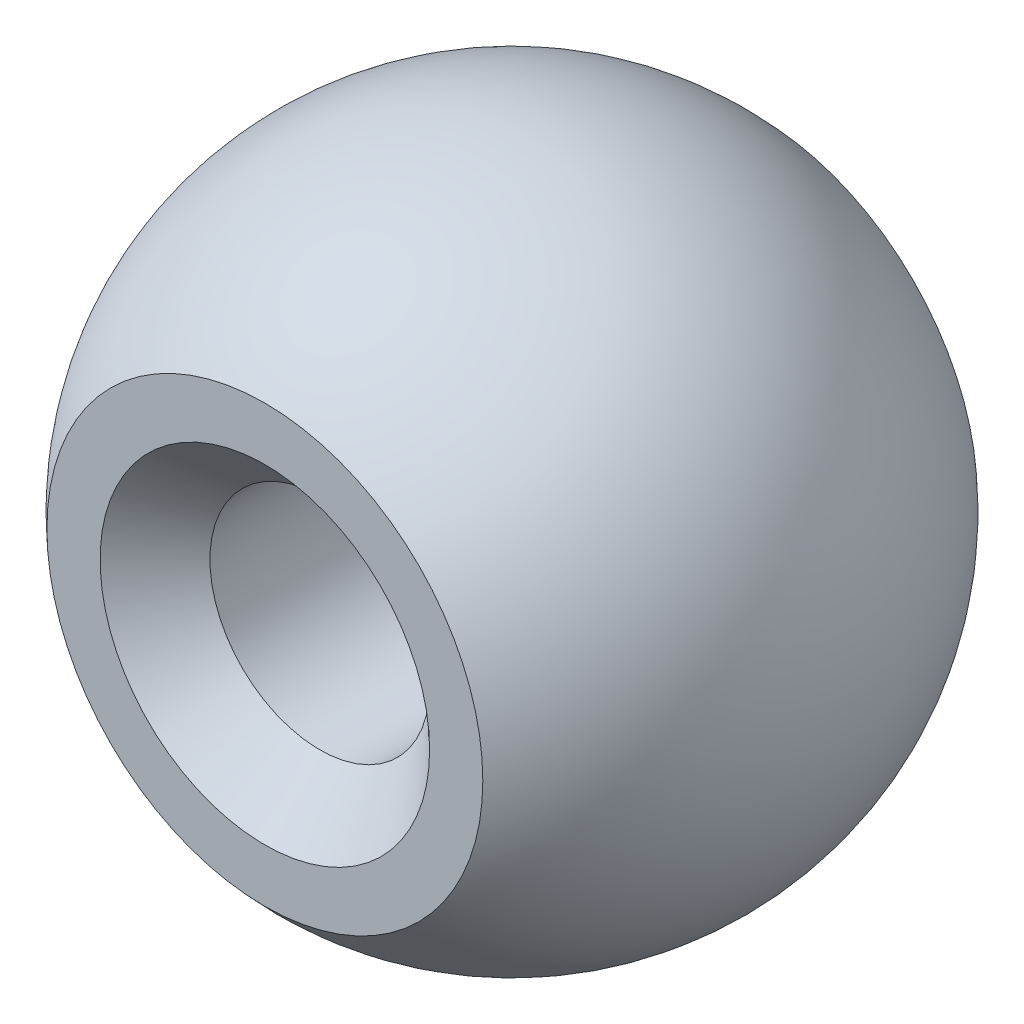
ISO-10303-21;
HEADER;
FILE_DESCRIPTION(('STEP AP214'),'2;1');
FILE_NAME('part.step','',(''),(''),'','','');
FILE_SCHEMA(('AUTOMOTIVE_DESIGN { 1 0 10303 214 1 1 1 1 }'));
ENDSEC;
DATA;
#1=APPLICATION_CONTEXT('core data for automotive mechanical design processes');
#2=APPLICATION_PROTOCOL_DEFINITION('international standard','automotive_design',2000,#1);
#3=PRODUCT_CONTEXT('',#1,'mechanical');
#4=PRODUCT('Part','Part','',(#3));
#5=PRODUCT_RELATED_PRODUCT_CATEGORY('part','',(#4));
#6=PRODUCT_DEFINITION_FORMATION('','',#4);
#7=PRODUCT_DEFINITION_CONTEXT('part definition',#1,'design');
#8=PRODUCT_DEFINITION('design','',#6,#7);
#9=PRODUCT_DEFINITION_SHAPE('','',#8);
#10=(LENGTH_UNIT() NAMED_UNIT(*) SI_UNIT(.MILLI.,.METRE.));
#11=(NAMED_UNIT(*) PLANE_ANGLE_UNIT() SI_UNIT($,.RADIAN.));
#12=(NAMED_UNIT(*) SI_UNIT($,.STERADIAN.) SOLID_ANGLE_UNIT());
#13=UNCERTAINTY_MEASURE_WITH_UNIT(LENGTH_MEASURE(1.E-05),#10,'distance_accuracy_value','');
#14=(GEOMETRIC_REPRESENTATION_CONTEXT(3) GLOBAL_UNCERTAINTY_ASSIGNED_CONTEXT((#13)) GLOBAL_UNIT_ASSIGNED_CONTEXT((#10,
#11,#12)) REPRESENTATION_CONTEXT('',''));
#15=CARTESIAN_POINT('',(0.,0.,0.));
#16=DIRECTION('',(0.,0.,1.));
#17=DIRECTION('',(1.,0.,0.));
#18=AXIS2_PLACEMENT_3D('',#15,#16,#17);
#19=CARTESIAN_POINT('',(0.,0.,0.));
#20=DIRECTION('',(0.,0.,1.));
#21=DIRECTION('',(1.,0.,0.));
#22=AXIS2_PLACEMENT_3D('',#19,#20,#21);
#23=SPHERICAL_SURFACE('',#22,6.);
#24=CARTESIAN_POINT('',(0.,0.,-4.5));
#25=DIRECTION('',(0.,0.,1.));
#26=DIRECTION('',(1.,0.,0.));
#27=AXIS2_PLACEMENT_3D('',#24,#25,#26);
#28=CIRCLE('',#27,3.96862696659689);
#29=CARTESIAN_POINT('',(3.96862696659689,0.,-4.5));
#30=VERTEX_POINT('',#29);
#31=EDGE_CURVE('E10',#30,#30,#28,.T.);
#32=CARTESIAN_POINT('',(0.,0.,4.5));
#33=DIRECTION('',(0.,0.,1.));
#34=DIRECTION('',(1.,0.,0.));
#35=AXIS2_PLACEMENT_3D('',#32,#33,#34);
#36=CIRCLE('',#35,3.96862696659689);
#37=CARTESIAN_POINT('',(3.96862696659689,0.,4.5));
#38=VERTEX_POINT('',#37);
#39=EDGE_CURVE('E46',#38,#38,#36,.T.);
#40=CARTESIAN_POINT('',(3.96862696659689,0.,-4.5));
#41=CARTESIAN_POINT('',(4.04813476780701,0.,-4.42988448417367));
#42=CARTESIAN_POINT('',(4.12578044526497,0.,-4.35765791170532));
#43=CARTESIAN_POINT('',(4.27713817883407,0.,-4.20919440386366));
#44=CARTESIAN_POINT('',(4.35085023494521,0.,-4.13295746849034));
#45=CARTESIAN_POINT('',(4.4941313519782,0.,-3.97668498521782));
#46=CARTESIAN_POINT('',(4.56370041290005,0.,-3.89664943731862));
#47=CARTESIAN_POINT('',(4.69850076282097,0.,-3.73300516695229));
#48=CARTESIAN_POINT('',(4.76373205182003,0.,-3.64939644448515));
#49=CARTESIAN_POINT('',(4.8896734716426,0.,-3.47884049038039));
#50=CARTESIAN_POINT('',(4.9503836024661,0.,-3.39189325874275));
#51=CARTESIAN_POINT('',(5.06711223105534,0.,-3.21490454544201));
#52=CARTESIAN_POINT('',(5.12313072882108,0.,-3.1248630637789));
#53=CARTESIAN_POINT('',(5.23031873710099,0.,-2.94193874249415));
#54=CARTESIAN_POINT('',(5.28148824761517,0.,-2.84905590287252));
#55=CARTESIAN_POINT('',(5.37883456206913,0.,-2.66070975397032));
#56=CARTESIAN_POINT('',(5.42501136600891,0.,-2.56524644468976));
#57=CARTESIAN_POINT('',(5.51224256718487,0.,-2.37200748850401));
#58=CARTESIAN_POINT('',(5.55329696442104,0.,-2.27423184159881));
#59=CARTESIAN_POINT('',(5.63016804073458,0.,-2.07664283810176));
#60=CARTESIAN_POINT('',(5.66598471981195,0.,-1.9768294815099));
#61=CARTESIAN_POINT('',(5.73227975951892,0.,-1.77544540970266));
#62=CARTESIAN_POINT('',(5.76275812014852,0.,-1.67387469448727));
#63=CARTESIAN_POINT('',(5.81829091677091,0.,-1.46926119256368));
#64=CARTESIAN_POINT('',(5.84334535276371,0.,-1.36621840585547));
#65=CARTESIAN_POINT('',(5.8879599283703,0.,-1.1589501827416));
#66=CARTESIAN_POINT('',(5.90752006798411,0.,-1.05472474633594));
#67=CARTESIAN_POINT('',(5.94109111122104,0.,-0.845383967399882));
#68=CARTESIAN_POINT('',(5.95510201484416,0.,-0.740268624869488));
#69=CARTESIAN_POINT('',(5.97753523292316,0.,-0.529443276782206));
#70=CARTESIAN_POINT('',(5.98595754737904,0.,-0.423733271225317));
#71=CARTESIAN_POINT('',(5.99718993091746,0.,-0.212015510445619));
#72=CARTESIAN_POINT('',(6.,0.,-0.10600775522281));
#73=CARTESIAN_POINT('',(6.,0.,0.10600775522281));
#74=CARTESIAN_POINT('',(5.99718993091746,0.,0.212015510445619));
#75=CARTESIAN_POINT('',(5.98595754737904,0.,0.423733271225317));
#76=CARTESIAN_POINT('',(5.97753523292316,0.,0.529443276782206));
#77=CARTESIAN_POINT('',(5.95510201484416,0.,0.740268624869488));
#78=CARTESIAN_POINT('',(5.94109111122104,0.,0.845383967399882));
#79=CARTESIAN_POINT('',(5.90752006798411,0.,1.05472474633594));
#80=CARTESIAN_POINT('',(5.8879599283703,0.,1.1589501827416));
#81=CARTESIAN_POINT('',(5.84334535276371,0.,1.36621840585547));
#82=CARTESIAN_POINT('',(5.81829091677091,0.,1.46926119256368));
#83=CARTESIAN_POINT('',(5.76275812014852,0.,1.67387469448727));
#84=CARTESIAN_POINT('',(5.73227975951892,0.,1.77544540970266));
#85=CARTESIAN_POINT('',(5.66598471981195,0.,1.9768294815099));
#86=CARTESIAN_POINT('',(5.63016804073458,0.,2.07664283810176));
#87=CARTESIAN_POINT('',(5.55329696442104,0.,2.27423184159881));
#88=CARTESIAN_POINT('',(5.51224256718487,0.,2.37200748850401));
#89=CARTESIAN_POINT('',(5.42501136600891,0.,2.56524644468976));
#90=CARTESIAN_POINT('',(5.37883456206913,0.,2.66070975397032));
#91=CARTESIAN_POINT('',(5.28148824761517,0.,2.84905590287252));
#92=CARTESIAN_POINT('',(5.23031873710099,0.,2.94193874249415));
#93=CARTESIAN_POINT('',(5.12313072882108,0.,3.1248630637789));
#94=CARTESIAN_POINT('',(5.06711223105534,0.,3.21490454544201));
#95=CARTESIAN_POINT('',(4.9503836024661,0.,3.39189325874275));
#96=CARTESIAN_POINT('',(4.8896734716426,0.,3.47884049038039));
#97=CARTESIAN_POINT('',(4.76373205182003,0.,3.64939644448515));
#98=CARTESIAN_POINT('',(4.69850076282097,0.,3.73300516695229));
#99=CARTESIAN_POINT('',(4.56370041290005,0.,3.89664943731862));
#100=CARTESIAN_POINT('',(4.4941313519782,0.,3.97668498521782));
#101=CARTESIAN_POINT('',(4.35085023494521,0.,4.13295746849034));
#102=CARTESIAN_POINT('',(4.27713817883407,0.,4.20919440386366));
#103=CARTESIAN_POINT('',(4.12578044526497,0.,4.35765791170532));
#104=CARTESIAN_POINT('',(4.04813476780702,0.,4.42988448417367));
#105=CARTESIAN_POINT('',(3.96862696659689,0.,4.5));
#106=B_SPLINE_CURVE_WITH_KNOTS('',3,(#40,#41,#42,#43,#44,#45,#46,#47,#48,#49,#50,#51,#52,#53,
#54,#55,#56,#57,#58,#59,#60,#61,#62,#63,#64,#65,#66,#67,#68,#69,#70,#71,#72,#73,#74,#75,#76,#77,
#78,#79,#80,#81,#82,#83,#84,#85,#86,#87,#88,#89,#90,#91,#92,#93,#94,#95,#96,#97,#98,#99,#100,
#101,#102,#103,#104,#105),.UNSPECIFIED.,.F.,.F.,(4,2,2,2,2,2,2,2,2,2,2,2,2,2,2,2,2,2,2,2,2,2,2,
2,2,2,2,2,2,2,2,2,4),(0.,0.317986053500718,0.635972107001436,0.953958160502155,1.27194421400287,
1.58993026750359,1.90791632100431,2.22590237450503,2.54388842800575,2.86187448150647,
3.17986053500718,3.4978465885079,3.81583264200862,4.13381869550934,4.45180474901006,
4.76979080251078,5.08777685601149,5.40576290951221,5.72374896301293,6.04173501651365,
6.35972107001437,6.67770712351508,6.9956931770158,7.31367923051652,7.63166528401724,
7.94965133751796,8.26763739101868,8.5856234445194,8.90360949802011,9.22159555152083,
9.53958160502155,9.85756765852227,10.175553712023),.UNSPECIFIED.);
#107=EDGE_CURVE('BSEAM39',#30,#38,#106,.T.);
#108=ORIENTED_EDGE('',*,*,#31,.T.);
#109=ORIENTED_EDGE('',*,*,#39,.F.);
#110=ORIENTED_EDGE('',*,*,#107,.T.);
#111=ORIENTED_EDGE('',*,*,#107,.F.);
#112=EDGE_LOOP('',(#108,#110,#109,#111));
#113=FACE_BOUND('',#112,.T.);
#114=ADVANCED_FACE('F39',(#113),#23,.T.);
#115=CARTESIAN_POINT('',(0.,0.,-4.5));
#116=DIRECTION('',(0.,0.,-1.));
#117=DIRECTION('',(-1.,0.,0.));
#118=AXIS2_PLACEMENT_3D('',#115,#116,#117);
#119=PLANE('',#118);
#120=CARTESIAN_POINT('',(0.,0.,-4.5));
#121=DIRECTION('',(0.,0.,-1.));
#122=DIRECTION('',(-1.,0.,0.));
#123=AXIS2_PLACEMENT_3D('',#120,#121,#122);
#124=CIRCLE('',#123,2.);
#125=CARTESIAN_POINT('',(-2.,0.,-4.5));
#126=VERTEX_POINT('',#125);
#127=EDGE_CURVE('E51',#126,#126,#124,.T.);
#128=ORIENTED_EDGE('',*,*,#127,.F.);
#129=EDGE_LOOP('',(#128));
#130=FACE_BOUND('',#129,.T.);
#131=ORIENTED_EDGE('',*,*,#31,.F.);
#132=EDGE_LOOP('',(#131));
#133=FACE_BOUND('',#132,.T.);
#134=ADVANCED_FACE('F72',(#130,#133),#119,.T.);
#135=CARTESIAN_POINT('',(0.,0.,4.5));
#136=DIRECTION('',(0.,0.,1.));
#137=DIRECTION('',(1.,0.,0.));
#138=AXIS2_PLACEMENT_3D('',#135,#136,#137);
#139=PLANE('',#138);
#140=CARTESIAN_POINT('',(0.,0.,4.5));
#141=DIRECTION('',(0.,0.,1.));
#142=DIRECTION('',(1.,0.,0.));
#143=AXIS2_PLACEMENT_3D('',#140,#141,#142);
#144=CIRCLE('',#143,3.);
#145=CARTESIAN_POINT('',(3.,0.,4.5));
#146=VERTEX_POINT('',#145);
#147=EDGE_CURVE('E62',#146,#146,#144,.T.);
#148=ORIENTED_EDGE('',*,*,#147,.F.);
#149=EDGE_LOOP('',(#148));
#150=FACE_BOUND('',#149,.T.);
#151=ORIENTED_EDGE('',*,*,#39,.T.);
#152=EDGE_LOOP('',(#151));
#153=FACE_BOUND('',#152,.T.);
#154=ADVANCED_FACE('F69',(#150,#153),#139,.T.);
#155=CARTESIAN_POINT('',(0.,0.,4.5));
#156=DIRECTION('',(0.,0.,1.));
#157=DIRECTION('',(1.,0.,0.));
#158=AXIS2_PLACEMENT_3D('',#155,#156,#157);
#159=CYLINDRICAL_SURFACE('',#158,2.);
#160=CARTESIAN_POINT('',(0.,0.,3.5));
#161=DIRECTION('',(0.,0.,1.));
#162=DIRECTION('',(1.,0.,0.));
#163=AXIS2_PLACEMENT_3D('',#160,#161,#162);
#164=CIRCLE('',#163,2.);
#165=CARTESIAN_POINT('',(2.,0.,3.5));
#166=VERTEX_POINT('',#165);
#167=EDGE_CURVE('E56',#166,#166,#164,.T.);
#168=ORIENTED_EDGE('',*,*,#167,.T.);
#169=EDGE_LOOP('',(#168));
#170=FACE_BOUND('',#169,.T.);
#171=ORIENTED_EDGE('',*,*,#127,.T.);
#172=EDGE_LOOP('',(#171));
#173=FACE_BOUND('',#172,.T.);
#174=ADVANCED_FACE('F71',(#170,#173),#159,.F.);
#175=CARTESIAN_POINT('',(0.,0.,4.5));
#176=DIRECTION('',(0.,0.,1.));
#177=DIRECTION('',(1.,0.,0.));
#178=AXIS2_PLACEMENT_3D('',#175,#176,#177);
#179=CONICAL_SURFACE('',#178,3.,0.785398163397449);
#180=ORIENTED_EDGE('',*,*,#167,.F.);
#181=EDGE_LOOP('',(#180));
#182=FACE_BOUND('',#181,.T.);
#183=ORIENTED_EDGE('',*,*,#147,.T.);
#184=EDGE_LOOP('',(#183));
#185=FACE_BOUND('',#184,.T.);
#186=ADVANCED_FACE('F67',(#182,#185),#179,.F.);
#187=CLOSED_SHELL('',(#114,#134,#154,#174,#186));
#188=MANIFOLD_SOLID_BREP('B2',#187);
#189=ADVANCED_BREP_SHAPE_REPRESENTATION('',(#18,#188),#14);
#190=SHAPE_DEFINITION_REPRESENTATION(#9,#189);
ENDSEC;
END-ISO-10303-21;
